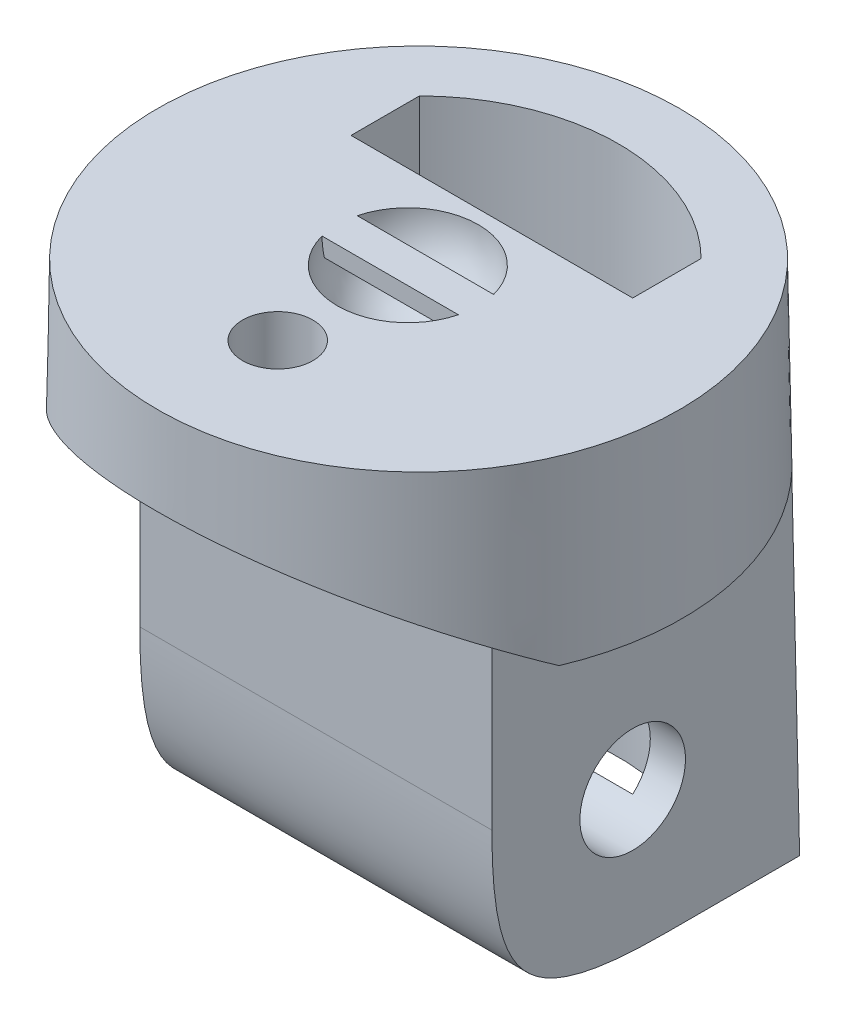
ISO-10303-21;
HEADER;
FILE_DESCRIPTION(('STEP AP214'),'2;1');
FILE_NAME('part.step','',(''),(''),'','','');
FILE_SCHEMA(('AUTOMOTIVE_DESIGN { 1 0 10303 214 1 1 1 1 }'));
ENDSEC;
DATA;
#1=APPLICATION_CONTEXT('core data for automotive mechanical design processes');
#2=APPLICATION_PROTOCOL_DEFINITION('international standard','automotive_design',2000,#1);
#3=PRODUCT_CONTEXT('',#1,'mechanical');
#4=PRODUCT('Part','Part','',(#3));
#5=PRODUCT_RELATED_PRODUCT_CATEGORY('part','',(#4));
#6=PRODUCT_DEFINITION_FORMATION('','',#4);
#7=PRODUCT_DEFINITION_CONTEXT('part definition',#1,'design');
#8=PRODUCT_DEFINITION('design','',#6,#7);
#9=PRODUCT_DEFINITION_SHAPE('','',#8);
#10=(LENGTH_UNIT() NAMED_UNIT(*) SI_UNIT(.MILLI.,.METRE.));
#11=(NAMED_UNIT(*) PLANE_ANGLE_UNIT() SI_UNIT($,.RADIAN.));
#12=(NAMED_UNIT(*) SI_UNIT($,.STERADIAN.) SOLID_ANGLE_UNIT());
#13=UNCERTAINTY_MEASURE_WITH_UNIT(LENGTH_MEASURE(1.E-05),#10,'distance_accuracy_value','');
#14=(GEOMETRIC_REPRESENTATION_CONTEXT(3) GLOBAL_UNCERTAINTY_ASSIGNED_CONTEXT((#13)) GLOBAL_UNIT_ASSIGNED_CONTEXT((#10,
#11,#12)) REPRESENTATION_CONTEXT('',''));
#15=CARTESIAN_POINT('',(0.,0.,0.));
#16=DIRECTION('',(0.,0.,1.));
#17=DIRECTION('',(1.,0.,0.));
#18=AXIS2_PLACEMENT_3D('',#15,#16,#17);
#19=CARTESIAN_POINT('',(0.,0.,0.));
#20=DIRECTION('',(0.,-1.,0.));
#21=DIRECTION('',(0.,0.,1.));
#22=AXIS2_PLACEMENT_3D('',#19,#20,#21);
#23=CONICAL_SURFACE('',#22,7.5,0.0174532925199434);
#24=CARTESIAN_POINT('',(0.,5.08726203218642,0.));
#25=DIRECTION('',(0.,-1.,0.));
#26=DIRECTION('',(0.,0.,-1.));
#27=AXIS2_PLACEMENT_3D('',#24,#25,#26);
#28=CIRCLE('',#27,7.41120151092133);
#29=CARTESIAN_POINT('',(0.,5.08726203218642,-7.41120151092133));
#30=VERTEX_POINT('',#29);
#31=EDGE_CURVE('E402',#30,#30,#28,.F.);
#32=ORIENTED_EDGE('',*,*,#31,.F.);
#33=EDGE_LOOP('',(#32));
#34=FACE_BOUND('',#33,.T.);
#35=CARTESIAN_POINT('',(0.,0.,0.));
#36=DIRECTION('',(0.,1.,0.));
#37=DIRECTION('',(0.,0.,1.));
#38=AXIS2_PLACEMENT_3D('',#35,#36,#37);
#39=CIRCLE('',#38,7.5);
#40=CARTESIAN_POINT('',(5.,0.,-5.59016994374948));
#41=VERTEX_POINT('',#40);
#42=CARTESIAN_POINT('',(6.90888086059139,0.,2.91845254444097));
#43=VERTEX_POINT('',#42);
#44=EDGE_CURVE('E372',#41,#43,#39,.F.);
#45=ORIENTED_EDGE('',*,*,#44,.F.);
#46=CARTESIAN_POINT('',(5.,6.27688547623236,-5.44229294462731));
#47=CARTESIAN_POINT('',(5.,3.77036377382038,-5.50170408148645));
#48=CARTESIAN_POINT('',(5.,1.2638316348017,-5.56067381564673));
#49=CARTESIAN_POINT('',(5.,-3.74925134349088,-5.67780370532054));
#50=CARTESIAN_POINT('',(5.,-6.25580218276311,-5.73596386090489));
#51=CARTESIAN_POINT('',(5.,-11.268920791042,-5.85154782971426));
#52=CARTESIAN_POINT('',(5.,-13.7754885600484,-5.90897164294989));
#53=CARTESIAN_POINT('',(5.,-18.7886397234326,-6.02314292162538));
#54=CARTESIAN_POINT('',(5.,-21.2952231178118,-6.07989038700611));
#55=CARTESIAN_POINT('',(5.,-23.8018134354958,-6.13632967030171));
#56=B_SPLINE_CURVE_WITH_KNOTS('',3,(#46,#47,#48,#49,#50,#51,#52,#53,#54,#55),.UNSPECIFIED.,.F.,
.F.,(4,2,2,2,4),(0.,7.52167703420821,15.0433534104974,22.5650296785992,30.0867066043943),.UNSPECIFIED.);
#57=CARTESIAN_POINT('',(5.,-10.,-5.82226138784558));
#58=VERTEX_POINT('',#57);
#59=EDGE_CURVE('E256',#41,#58,#56,.T.);
#60=ORIENTED_EDGE('',*,*,#59,.T.);
#61=CARTESIAN_POINT('',(0.,-10.,0.));
#62=DIRECTION('',(0.,1.,0.));
#63=DIRECTION('',(0.,0.,1.));
#64=AXIS2_PLACEMENT_3D('',#61,#62,#63);
#65=CIRCLE('',#64,7.67455064928218);
#66=CARTESIAN_POINT('',(-5.,-10.,-5.82226138784557));
#67=VERTEX_POINT('',#66);
#68=EDGE_CURVE('E357',#58,#67,#65,.T.);
#69=ORIENTED_EDGE('',*,*,#68,.T.);
#70=CARTESIAN_POINT('',(-5.,6.27688547623236,-5.44229294462731));
#71=CARTESIAN_POINT('',(-5.,3.77036377382037,-5.50170408148644));
#72=CARTESIAN_POINT('',(-5.,1.26383163480169,-5.56067381564673));
#73=CARTESIAN_POINT('',(-5.,-3.74925134349088,-5.67780370532054));
#74=CARTESIAN_POINT('',(-5.,-6.25580218276312,-5.73596386090489));
#75=CARTESIAN_POINT('',(-5.,-11.268920791042,-5.85154782971426));
#76=CARTESIAN_POINT('',(-5.,-13.7754885600484,-5.90897164294989));
#77=CARTESIAN_POINT('',(-5.,-18.7886397234326,-6.02314292162538));
#78=CARTESIAN_POINT('',(-5.,-21.2952231178118,-6.07989038700611));
#79=CARTESIAN_POINT('',(-5.,-23.8018134354958,-6.1363296703017));
#80=B_SPLINE_CURVE_WITH_KNOTS('',3,(#70,#71,#72,#73,#74,#75,#76,#77,#78,#79),.UNSPECIFIED.,.F.,
.F.,(4,2,2,2,4),(0.,7.52167703420821,15.0433534104974,22.5650296785992,30.0867066043943),.UNSPECIFIED.);
#81=CARTESIAN_POINT('',(-5.,0.,-5.59016994374947));
#82=VERTEX_POINT('',#81);
#83=EDGE_CURVE('E340',#82,#67,#80,.T.);
#84=ORIENTED_EDGE('',*,*,#83,.F.);
#85=CARTESIAN_POINT('',(0.,0.,0.));
#86=DIRECTION('',(0.,-1.,0.));
#87=DIRECTION('',(0.,0.,-1.));
#88=AXIS2_PLACEMENT_3D('',#85,#86,#87);
#89=CIRCLE('',#88,7.5);
#90=CARTESIAN_POINT('',(-6.90888086059139,0.,2.91845254444097));
#91=VERTEX_POINT('',#90);
#92=EDGE_CURVE('E347',#82,#91,#89,.F.);
#93=ORIENTED_EDGE('',*,*,#92,.T.);
#94=CARTESIAN_POINT('',(0.,-1.72878259922326,-0.075886752654714));
#95=DIRECTION('',(0.,0.86602540378444,-0.499999999999998));
#96=DIRECTION('',(0.,-0.499999999999998,-0.86602540378444));
#97=AXIS2_PLACEMENT_3D('',#94,#95,#96);
#98=ELLIPSE('',#97,8.69509829574299,7.52979362135817);
#99=EDGE_CURVE('E360',#43,#91,#98,.F.);
#100=ORIENTED_EDGE('',*,*,#99,.F.);
#101=EDGE_LOOP('',(#45,#60,#69,#84,#93,#100));
#102=FACE_BOUND('',#101,.T.);
#103=ADVANCED_FACE('F43',(#34,#102),#23,.T.);
#104=CARTESIAN_POINT('',(0.,-10.,0.));
#105=DIRECTION('',(0.,1.,0.));
#106=DIRECTION('',(0.,0.,1.));
#107=AXIS2_PLACEMENT_3D('',#104,#105,#106);
#108=PLANE('',#107);
#109=CARTESIAN_POINT('',(-5.5,-10.,-2.08154745555903));
#110=CARTESIAN_POINT('',(-1.83333333333334,-10.,-2.08154745555903));
#111=CARTESIAN_POINT('',(1.83333333333333,-10.,-2.08154745555903));
#112=CARTESIAN_POINT('',(5.5,-10.,-2.08154745555903));
#113=(BOUNDED_CURVE() B_SPLINE_CURVE(3,(#109,#110,#111,#112),.UNSPECIFIED.,.F.,
.F.) B_SPLINE_CURVE_WITH_KNOTS((4,4),(-0.0055,0.0055),
.UNSPECIFIED.) CURVE() GEOMETRIC_REPRESENTATION_ITEM() RATIONAL_B_SPLINE_CURVE((1.,1.,1.,1.)) REPRESENTATION_ITEM(''));
#114=CARTESIAN_POINT('',(5.,-10.,-2.08154745555903));
#115=VERTEX_POINT('',#114);
#116=CARTESIAN_POINT('',(4.,-10.,-2.08154745555903));
#117=VERTEX_POINT('',#116);
#118=EDGE_CURVE('E292',#115,#117,#113,.F.);
#119=ORIENTED_EDGE('',*,*,#118,.T.);
#120=DIRECTION('',(0.,0.,1.));
#121=VECTOR('',#120,1.);
#122=CARTESIAN_POINT('',(4.,-10.,-2.08154745555903));
#123=LINE('',#122,#121);
#124=CARTESIAN_POINT('',(4.,-10.,-4.02498758647387));
#125=VERTEX_POINT('',#124);
#126=EDGE_CURVE('E193',#125,#117,#123,.T.);
#127=ORIENTED_EDGE('',*,*,#126,.F.);
#128=CARTESIAN_POINT('',(0.,-10.,0.));
#129=DIRECTION('',(0.,-1.,0.));
#130=DIRECTION('',(0.,0.,-1.));
#131=AXIS2_PLACEMENT_3D('',#128,#129,#130);
#132=CIRCLE('',#131,5.67455064928218);
#133=CARTESIAN_POINT('',(-4.,-10.,-4.02498758647387));
#134=VERTEX_POINT('',#133);
#135=EDGE_CURVE('E190',#134,#125,#132,.T.);
#136=ORIENTED_EDGE('',*,*,#135,.F.);
#137=DIRECTION('',(0.,0.,-1.));
#138=VECTOR('',#137,1.);
#139=CARTESIAN_POINT('',(-4.,-10.,-2.08154745555903));
#140=LINE('',#139,#138);
#141=CARTESIAN_POINT('',(-4.,-10.,-2.08154745555903));
#142=VERTEX_POINT('',#141);
#143=EDGE_CURVE('E194',#142,#134,#140,.T.);
#144=ORIENTED_EDGE('',*,*,#143,.F.);
#145=CARTESIAN_POINT('',(-5.5,-10.,-2.08154745555903));
#146=CARTESIAN_POINT('',(-1.83333333333334,-10.,-2.08154745555903));
#147=CARTESIAN_POINT('',(1.83333333333333,-10.,-2.08154745555903));
#148=CARTESIAN_POINT('',(5.5,-10.,-2.08154745555903));
#149=(BOUNDED_CURVE() B_SPLINE_CURVE(3,(#145,#146,#147,#148),.UNSPECIFIED.,.F.,
.F.) B_SPLINE_CURVE_WITH_KNOTS((4,4),(-0.0055,0.0055),
.UNSPECIFIED.) CURVE() GEOMETRIC_REPRESENTATION_ITEM() RATIONAL_B_SPLINE_CURVE((1.,1.,1.,1.)) REPRESENTATION_ITEM(''));
#150=CARTESIAN_POINT('',(-5.,-10.,-2.08154745555903));
#151=VERTEX_POINT('',#150);
#152=EDGE_CURVE('E313',#142,#151,#149,.F.);
#153=ORIENTED_EDGE('',*,*,#152,.T.);
#154=DIRECTION('',(0.,0.,1.));
#155=VECTOR('',#154,1.);
#156=CARTESIAN_POINT('',(-5.,-10.,-7.67455064928218));
#157=LINE('',#156,#155);
#158=EDGE_CURVE('E368',#67,#151,#157,.T.);
#159=ORIENTED_EDGE('',*,*,#158,.F.);
#160=ORIENTED_EDGE('',*,*,#68,.F.);
#161=DIRECTION('',(0.,0.,1.));
#162=VECTOR('',#161,1.);
#163=CARTESIAN_POINT('',(5.,-10.,-7.67455064928218));
#164=LINE('',#163,#162);
#165=EDGE_CURVE('E363',#58,#115,#164,.T.);
#166=ORIENTED_EDGE('',*,*,#165,.T.);
#167=EDGE_LOOP('',(#119,#127,#136,#144,#153,#159,#160,#166));
#168=FACE_BOUND('',#167,.T.);
#169=ADVANCED_FACE('F323',(#168),#108,.F.);
#170=CARTESIAN_POINT('',(-7.67455064928218,-10.,2.91845254444097));
#171=DIRECTION('',(0.,0.,-1.));
#172=DIRECTION('',(-1.,0.,0.));
#173=AXIS2_PLACEMENT_3D('',#170,#171,#172);
#174=PLANE('',#173);
#175=DIRECTION('',(0.,1.,0.));
#176=VECTOR('',#175,1.);
#177=CARTESIAN_POINT('',(-5.,0.,2.91845254444097));
#178=LINE('',#177,#176);
#179=CARTESIAN_POINT('',(-5.,-5.,2.91845254444097));
#180=VERTEX_POINT('',#179);
#181=CARTESIAN_POINT('',(-5.,0.,2.91845254444097));
#182=VERTEX_POINT('',#181);
#183=EDGE_CURVE('E320',#180,#182,#178,.T.);
#184=ORIENTED_EDGE('',*,*,#183,.F.);
#185=CARTESIAN_POINT('',(5.5,-5.,2.91845254444097));
#186=CARTESIAN_POINT('',(1.83333333333333,-5.,2.91845254444097));
#187=CARTESIAN_POINT('',(-1.83333333333334,-5.,2.91845254444097));
#188=CARTESIAN_POINT('',(-5.5,-5.,2.91845254444097));
#189=(BOUNDED_CURVE() B_SPLINE_CURVE(3,(#185,#186,#187,#188),.UNSPECIFIED.,.F.,
.F.) B_SPLINE_CURVE_WITH_KNOTS((4,4),(-0.0055,0.0055),
.UNSPECIFIED.) CURVE() GEOMETRIC_REPRESENTATION_ITEM() RATIONAL_B_SPLINE_CURVE((1.,1.,1.,1.)) REPRESENTATION_ITEM(''));
#190=CARTESIAN_POINT('',(5.,-5.,2.91845254444097));
#191=VERTEX_POINT('',#190);
#192=EDGE_CURVE('E388',#180,#191,#189,.F.);
#193=ORIENTED_EDGE('',*,*,#192,.T.);
#194=DIRECTION('',(0.,1.,0.));
#195=VECTOR('',#194,1.);
#196=CARTESIAN_POINT('',(5.,0.,2.91845254444097));
#197=LINE('',#196,#195);
#198=CARTESIAN_POINT('',(5.,0.,2.91845254444097));
#199=VERTEX_POINT('',#198);
#200=EDGE_CURVE('E367',#191,#199,#197,.T.);
#201=ORIENTED_EDGE('',*,*,#200,.T.);
#202=DIRECTION('',(1.,0.,0.));
#203=VECTOR('',#202,1.);
#204=CARTESIAN_POINT('',(-7.67455064928218,0.,2.91845254444097));
#205=LINE('',#204,#203);
#206=EDGE_CURVE('E358',#182,#199,#205,.T.);
#207=ORIENTED_EDGE('',*,*,#206,.F.);
#208=EDGE_LOOP('',(#184,#193,#201,#207));
#209=FACE_BOUND('',#208,.T.);
#210=ADVANCED_FACE('F332',(#209),#174,.F.);
#211=CARTESIAN_POINT('',(-7.67455064928218,0.,2.91845254444097));
#212=DIRECTION('',(0.,0.86602540378444,-0.499999999999998));
#213=DIRECTION('',(0.,0.499999999999998,0.86602540378444));
#214=AXIS2_PLACEMENT_3D('',#211,#212,#213);
#215=PLANE('',#214);
#216=CARTESIAN_POINT('',(0.,0.62443171460836,4.));
#217=DIRECTION('',(0.,0.86602540378444,-0.499999999999998));
#218=DIRECTION('',(0.,0.499999999999998,0.86602540378444));
#219=AXIS2_PLACEMENT_3D('',#216,#217,#218);
#220=ELLIPSE('',#219,1.15470053837925,1.);
#221=CARTESIAN_POINT('',(0.,1.20178198379798,5.));
#222=VERTEX_POINT('',#221);
#223=EDGE_CURVE('E186',#222,#222,#220,.T.);
#224=ORIENTED_EDGE('',*,*,#223,.T.);
#225=EDGE_LOOP('',(#224));
#226=FACE_BOUND('',#225,.T.);
#227=ORIENTED_EDGE('',*,*,#99,.T.);
#228=EDGE_CURVE('E354',#91,#182,#205,.T.);
#229=ORIENTED_EDGE('',*,*,#228,.T.);
#230=ORIENTED_EDGE('',*,*,#206,.T.);
#231=EDGE_CURVE('E353',#199,#43,#205,.T.);
#232=ORIENTED_EDGE('',*,*,#231,.T.);
#233=EDGE_LOOP('',(#227,#229,#230,#232));
#234=FACE_BOUND('',#233,.T.);
#235=ADVANCED_FACE('F385',(#226,#234),#215,.F.);
#236=CARTESIAN_POINT('',(0.,0.,-7.67455064928218));
#237=DIRECTION('',(0.,-1.,0.));
#238=DIRECTION('',(0.,0.,-1.));
#239=AXIS2_PLACEMENT_3D('',#236,#237,#238);
#240=PLANE('',#239);
#241=DIRECTION('',(0.,0.,1.));
#242=VECTOR('',#241,1.);
#243=CARTESIAN_POINT('',(-5.,0.,-7.67455064928218));
#244=LINE('',#243,#242);
#245=EDGE_CURVE('E348',#82,#182,#244,.T.);
#246=ORIENTED_EDGE('',*,*,#245,.T.);
#247=ORIENTED_EDGE('',*,*,#228,.F.);
#248=ORIENTED_EDGE('',*,*,#92,.F.);
#249=EDGE_LOOP('',(#246,#247,#248));
#250=FACE_BOUND('',#249,.T.);
#251=ADVANCED_FACE('F467',(#250),#240,.T.);
#252=CARTESIAN_POINT('',(-5.,0.,-7.67455064928218));
#253=DIRECTION('',(1.,0.,0.));
#254=DIRECTION('',(0.,0.,-1.));
#255=AXIS2_PLACEMENT_3D('',#252,#253,#254);
#256=PLANE('',#255);
#257=CARTESIAN_POINT('',(-5.,-6.,-1.08154745555903));
#258=DIRECTION('',(1.,0.,0.));
#259=DIRECTION('',(0.,0.,-1.));
#260=AXIS2_PLACEMENT_3D('',#257,#258,#259);
#261=CIRCLE('',#260,1.5);
#262=CARTESIAN_POINT('',(-5.,-6.,-2.58154745555903));
#263=VERTEX_POINT('',#262);
#264=EDGE_CURVE('E390',#263,#263,#261,.T.);
#265=ORIENTED_EDGE('',*,*,#264,.T.);
#266=EDGE_LOOP('',(#265));
#267=FACE_BOUND('',#266,.T.);
#268=ORIENTED_EDGE('',*,*,#158,.T.);
#269=CARTESIAN_POINT('',(-5.,-5.,2.91845254444097));
#270=CARTESIAN_POINT('',(-5.,-10.,2.91845254444097));
#271=CARTESIAN_POINT('',(-5.,-10.,-2.08154745555903));
#272=(BOUNDED_CURVE() B_SPLINE_CURVE(2,(#269,#270,#271),.UNSPECIFIED.,.F.,
.F.) B_SPLINE_CURVE_WITH_KNOTS((3,3),(0.,1.),
.UNSPECIFIED.) CURVE() GEOMETRIC_REPRESENTATION_ITEM() RATIONAL_B_SPLINE_CURVE((1.,1.5,1.)) REPRESENTATION_ITEM(''));
#273=EDGE_CURVE('E278',#151,#180,#272,.F.);
#274=ORIENTED_EDGE('',*,*,#273,.T.);
#275=ORIENTED_EDGE('',*,*,#183,.T.);
#276=ORIENTED_EDGE('',*,*,#245,.F.);
#277=ORIENTED_EDGE('',*,*,#83,.T.);
#278=EDGE_LOOP('',(#268,#274,#275,#276,#277));
#279=FACE_BOUND('',#278,.T.);
#280=ADVANCED_FACE('F250',(#267,#279),#256,.F.);
#281=CARTESIAN_POINT('',(5.,0.,-7.67455064928218));
#282=DIRECTION('',(1.,0.,0.));
#283=DIRECTION('',(0.,0.,-1.));
#284=AXIS2_PLACEMENT_3D('',#281,#282,#283);
#285=PLANE('',#284);
#286=CARTESIAN_POINT('',(5.,-6.,-1.08154745555903));
#287=DIRECTION('',(1.,0.,0.));
#288=DIRECTION('',(0.,0.,-1.));
#289=AXIS2_PLACEMENT_3D('',#286,#287,#288);
#290=CIRCLE('',#289,1.5);
#291=CARTESIAN_POINT('',(5.,-6.,-2.58154745555903));
#292=VERTEX_POINT('',#291);
#293=EDGE_CURVE('E393',#292,#292,#290,.T.);
#294=ORIENTED_EDGE('',*,*,#293,.F.);
#295=EDGE_LOOP('',(#294));
#296=FACE_BOUND('',#295,.T.);
#297=ORIENTED_EDGE('',*,*,#200,.F.);
#298=CARTESIAN_POINT('',(5.,-10.,-2.08154745555903));
#299=CARTESIAN_POINT('',(5.,-10.,2.91845254444097));
#300=CARTESIAN_POINT('',(5.,-5.,2.91845254444097));
#301=(BOUNDED_CURVE() B_SPLINE_CURVE(2,(#298,#299,#300),.UNSPECIFIED.,.F.,
.F.) B_SPLINE_CURVE_WITH_KNOTS((3,3),(0.,1.),
.UNSPECIFIED.) CURVE() GEOMETRIC_REPRESENTATION_ITEM() RATIONAL_B_SPLINE_CURVE((1.,1.5,1.)) REPRESENTATION_ITEM(''));
#302=EDGE_CURVE('E444',#191,#115,#301,.F.);
#303=ORIENTED_EDGE('',*,*,#302,.T.);
#304=ORIENTED_EDGE('',*,*,#165,.F.);
#305=ORIENTED_EDGE('',*,*,#59,.F.);
#306=DIRECTION('',(0.,0.,1.));
#307=VECTOR('',#306,1.);
#308=CARTESIAN_POINT('',(5.,0.,-7.67455064928218));
#309=LINE('',#308,#307);
#310=EDGE_CURVE('E366',#41,#199,#309,.T.);
#311=ORIENTED_EDGE('',*,*,#310,.T.);
#312=EDGE_LOOP('',(#297,#303,#304,#305,#311));
#313=FACE_BOUND('',#312,.T.);
#314=ADVANCED_FACE('F245',(#296,#313),#285,.T.);
#315=CARTESIAN_POINT('',(0.,0.,-7.67455064928218));
#316=DIRECTION('',(0.,1.,0.));
#317=DIRECTION('',(0.,0.,1.));
#318=AXIS2_PLACEMENT_3D('',#315,#316,#317);
#319=PLANE('',#318);
#320=ORIENTED_EDGE('',*,*,#44,.T.);
#321=ORIENTED_EDGE('',*,*,#231,.F.);
#322=ORIENTED_EDGE('',*,*,#310,.F.);
#323=EDGE_LOOP('',(#320,#321,#322));
#324=FACE_BOUND('',#323,.T.);
#325=ADVANCED_FACE('F241',(#324),#319,.F.);
#326=CARTESIAN_POINT('',(-7.5,-6.,-1.08154745555903));
#327=DIRECTION('',(1.,0.,0.));
#328=DIRECTION('',(0.,0.,-1.));
#329=AXIS2_PLACEMENT_3D('',#326,#327,#328);
#330=CYLINDRICAL_SURFACE('',#329,1.5);
#331=DIRECTION('',(1.,0.,0.));
#332=VECTOR('',#331,1.);
#333=CARTESIAN_POINT('',(-7.5,-4.8819660112501,-2.08154745555903));
#334=LINE('',#333,#332);
#335=CARTESIAN_POINT('',(-4.,-4.8819660112501,-2.08154745555903));
#336=VERTEX_POINT('',#335);
#337=CARTESIAN_POINT('',(4.,-4.8819660112501,-2.08154745555903));
#338=VERTEX_POINT('',#337);
#339=EDGE_CURVE('E406',#336,#338,#334,.T.);
#340=ORIENTED_EDGE('',*,*,#339,.T.);
#341=CARTESIAN_POINT('',(4.,-6.,-1.08154745555903));
#342=DIRECTION('',(1.,0.,0.));
#343=DIRECTION('',(0.,0.,-1.));
#344=AXIS2_PLACEMENT_3D('',#341,#342,#343);
#345=CIRCLE('',#344,1.5);
#346=CARTESIAN_POINT('',(4.,-7.1180339887499,-2.08154745555903));
#347=VERTEX_POINT('',#346);
#348=EDGE_CURVE('E409',#338,#347,#345,.F.);
#349=ORIENTED_EDGE('',*,*,#348,.T.);
#350=DIRECTION('',(1.,0.,0.));
#351=VECTOR('',#350,1.);
#352=CARTESIAN_POINT('',(-7.5,-7.1180339887499,-2.08154745555903));
#353=LINE('',#352,#351);
#354=CARTESIAN_POINT('',(-4.,-7.1180339887499,-2.08154745555903));
#355=VERTEX_POINT('',#354);
#356=EDGE_CURVE('E403',#347,#355,#353,.F.);
#357=ORIENTED_EDGE('',*,*,#356,.T.);
#358=CARTESIAN_POINT('',(-4.,-6.,-1.08154745555903));
#359=DIRECTION('',(-1.,0.,0.));
#360=DIRECTION('',(0.,0.,1.));
#361=AXIS2_PLACEMENT_3D('',#358,#359,#360);
#362=CIRCLE('',#361,1.5);
#363=EDGE_CURVE('E199',#355,#336,#362,.F.);
#364=ORIENTED_EDGE('',*,*,#363,.T.);
#365=EDGE_LOOP('',(#340,#349,#357,#364));
#366=FACE_BOUND('',#365,.T.);
#367=ORIENTED_EDGE('',*,*,#293,.T.);
#368=EDGE_LOOP('',(#367));
#369=FACE_BOUND('',#368,.T.);
#370=ORIENTED_EDGE('',*,*,#264,.F.);
#371=EDGE_LOOP('',(#370));
#372=FACE_BOUND('',#371,.T.);
#373=ADVANCED_FACE('F238',(#366,#369,#372),#330,.F.);
#374=CARTESIAN_POINT('',(5.5,-10.,-2.08154745555903));
#375=CARTESIAN_POINT('',(1.83333333333333,-10.,-2.08154745555903));
#376=CARTESIAN_POINT('',(-1.83333333333334,-10.,-2.08154745555903));
#377=CARTESIAN_POINT('',(-5.5,-10.,-2.08154745555903));
#378=CARTESIAN_POINT('',(5.5,-10.,2.91845254444097));
#379=CARTESIAN_POINT('',(1.83333333333333,-10.,2.91845254444097));
#380=CARTESIAN_POINT('',(-1.83333333333334,-10.,2.91845254444097));
#381=CARTESIAN_POINT('',(-5.5,-10.,2.91845254444097));
#382=CARTESIAN_POINT('',(5.5,-5.,2.91845254444097));
#383=CARTESIAN_POINT('',(1.83333333333333,-5.,2.91845254444097));
#384=CARTESIAN_POINT('',(-1.83333333333334,-5.,2.91845254444097));
#385=CARTESIAN_POINT('',(-5.5,-5.,2.91845254444097));
#386=(BOUNDED_SURFACE() B_SPLINE_SURFACE(2,3,((#374,#375,#376,#377),(#378,#379,#380,#381),(#382,
#383,#384,#385)),.UNSPECIFIED.,.F.,.F.,.F.) B_SPLINE_SURFACE_WITH_KNOTS((3,3),(4,4),(0.,1.),
(-0.0055,0.0055),.UNSPECIFIED.) GEOMETRIC_REPRESENTATION_ITEM() RATIONAL_B_SPLINE_SURFACE(((1.,
1.,1.,1.),(1.5,1.5,1.5,1.5),(1.,1.,1.,1.))) REPRESENTATION_ITEM('') SURFACE());
#387=CARTESIAN_POINT('',(-5.5,-10.,-2.08154745555903));
#388=CARTESIAN_POINT('',(-1.83333333333334,-10.,-2.08154745555903));
#389=CARTESIAN_POINT('',(1.83333333333333,-10.,-2.08154745555903));
#390=CARTESIAN_POINT('',(5.5,-10.,-2.08154745555903));
#391=(BOUNDED_CURVE() B_SPLINE_CURVE(3,(#387,#388,#389,#390),.UNSPECIFIED.,.F.,
.F.) B_SPLINE_CURVE_WITH_KNOTS((4,4),(-0.0055,0.0055),
.UNSPECIFIED.) CURVE() GEOMETRIC_REPRESENTATION_ITEM() RATIONAL_B_SPLINE_CURVE((1.,1.,1.,1.)) REPRESENTATION_ITEM(''));
#392=EDGE_CURVE('E189',#117,#142,#391,.F.);
#393=ORIENTED_EDGE('',*,*,#302,.F.);
#394=ORIENTED_EDGE('',*,*,#192,.F.);
#395=ORIENTED_EDGE('',*,*,#273,.F.);
#396=ORIENTED_EDGE('',*,*,#152,.F.);
#397=ORIENTED_EDGE('',*,*,#392,.F.);
#398=ORIENTED_EDGE('',*,*,#118,.F.);
#399=EDGE_LOOP('',(#393,#394,#395,#396,#397,#398));
#400=FACE_BOUND('',#399,.T.);
#401=ADVANCED_FACE('F46',(#400),#386,.T.);
#402=CARTESIAN_POINT('',(-7.5,5.08726203218642,11.7963262650345));
#403=DIRECTION('',(0.,-1.,0.));
#404=DIRECTION('',(0.,0.,-1.));
#405=AXIS2_PLACEMENT_3D('',#402,#403,#404);
#406=PLANE('',#405);
#407=CARTESIAN_POINT('',(0.,5.08726203218642,0.305006360196813));
#408=DIRECTION('',(0.,-1.,0.));
#409=DIRECTION('',(0.,0.,-1.));
#410=AXIS2_PLACEMENT_3D('',#407,#408,#409);
#411=CIRCLE('',#410,2.);
#412=CARTESIAN_POINT('',(1.93649167310371,5.08726203218642,-0.194993639803186));
#413=VERTEX_POINT('',#412);
#414=CARTESIAN_POINT('',(-1.93649167310371,5.08726203218642,-0.194993639803186));
#415=VERTEX_POINT('',#414);
#416=EDGE_CURVE('E164',#413,#415,#411,.F.);
#417=ORIENTED_EDGE('',*,*,#416,.F.);
#418=DIRECTION('',(-1.,0.,0.));
#419=VECTOR('',#418,1.);
#420=CARTESIAN_POINT('',(-1.93649167310371,5.08726203218642,-0.194993639803186));
#421=LINE('',#420,#419);
#422=EDGE_CURVE('E175',#413,#415,#421,.T.);
#423=ORIENTED_EDGE('',*,*,#422,.T.);
#424=EDGE_LOOP('',(#417,#423));
#425=FACE_BOUND('',#424,.T.);
#426=CARTESIAN_POINT('',(-1.93649167310371,5.08726203218642,0.805006360196814));
#427=VERTEX_POINT('',#426);
#428=CARTESIAN_POINT('',(1.93649167310371,5.08726203218642,0.805006360196814));
#429=VERTEX_POINT('',#428);
#430=EDGE_CURVE('E157',#427,#429,#411,.F.);
#431=ORIENTED_EDGE('',*,*,#430,.F.);
#432=DIRECTION('',(1.,0.,0.));
#433=VECTOR('',#432,1.);
#434=CARTESIAN_POINT('',(-1.93649167310371,5.08726203218642,0.805006360196814));
#435=LINE('',#434,#433);
#436=EDGE_CURVE('E162',#427,#429,#435,.T.);
#437=ORIENTED_EDGE('',*,*,#436,.T.);
#438=EDGE_LOOP('',(#431,#437));
#439=FACE_BOUND('',#438,.T.);
#440=CARTESIAN_POINT('',(0.,5.08726203218642,4.));
#441=DIRECTION('',(0.,1.,0.));
#442=DIRECTION('',(0.,0.,1.));
#443=AXIS2_PLACEMENT_3D('',#440,#441,#442);
#444=CIRCLE('',#443,1.);
#445=CARTESIAN_POINT('',(0.,5.08726203218642,5.));
#446=VERTEX_POINT('',#445);
#447=EDGE_CURVE('E163',#446,#446,#444,.T.);
#448=ORIENTED_EDGE('',*,*,#447,.F.);
#449=EDGE_LOOP('',(#448));
#450=FACE_BOUND('',#449,.T.);
#451=DIRECTION('',(0.,0.,1.));
#452=VECTOR('',#451,1.);
#453=CARTESIAN_POINT('',(4.,5.08726203218642,11.7963262650345));
#454=LINE('',#453,#452);
#455=CARTESIAN_POINT('',(4.,5.08726203218642,-4.02498758647387));
#456=VERTEX_POINT('',#455);
#457=CARTESIAN_POINT('',(4.,5.08726203218642,-2.08154745555903));
#458=VERTEX_POINT('',#457);
#459=EDGE_CURVE('E426',#456,#458,#454,.T.);
#460=ORIENTED_EDGE('',*,*,#459,.T.);
#461=DIRECTION('',(-1.,0.,0.));
#462=VECTOR('',#461,1.);
#463=CARTESIAN_POINT('',(-7.5,5.08726203218642,-2.08154745555903));
#464=LINE('',#463,#462);
#465=CARTESIAN_POINT('',(-4.,5.08726203218642,-2.08154745555903));
#466=VERTEX_POINT('',#465);
#467=EDGE_CURVE('E308',#458,#466,#464,.T.);
#468=ORIENTED_EDGE('',*,*,#467,.T.);
#469=DIRECTION('',(0.,0.,-1.));
#470=VECTOR('',#469,1.);
#471=CARTESIAN_POINT('',(-4.00000000000002,5.08726203218642,11.7963262650345));
#472=LINE('',#471,#470);
#473=CARTESIAN_POINT('',(-4.,5.08726203218642,-4.02498758647387));
#474=VERTEX_POINT('',#473);
#475=EDGE_CURVE('E440',#466,#474,#472,.T.);
#476=ORIENTED_EDGE('',*,*,#475,.T.);
#477=CARTESIAN_POINT('',(0.,5.08726203218642,0.));
#478=DIRECTION('',(0.,-1.,0.));
#479=DIRECTION('',(0.,0.,-1.));
#480=AXIS2_PLACEMENT_3D('',#477,#478,#479);
#481=CIRCLE('',#480,5.67455064928218);
#482=EDGE_CURVE('E439',#474,#456,#481,.T.);
#483=ORIENTED_EDGE('',*,*,#482,.T.);
#484=EDGE_LOOP('',(#460,#468,#476,#483));
#485=FACE_BOUND('',#484,.T.);
#486=ORIENTED_EDGE('',*,*,#31,.T.);
#487=EDGE_LOOP('',(#486));
#488=FACE_BOUND('',#487,.T.);
#489=ADVANCED_FACE('F159',(#425,#439,#450,#485,#488),#406,.F.);
#490=CARTESIAN_POINT('',(4.,5.13726203218642,-2.08154745555903));
#491=DIRECTION('',(0.,0.,1.));
#492=DIRECTION('',(1.,0.,0.));
#493=AXIS2_PLACEMENT_3D('',#490,#491,#492);
#494=PLANE('',#493);
#495=DIRECTION('',(0.,-1.,0.));
#496=VECTOR('',#495,1.);
#497=CARTESIAN_POINT('',(4.,5.13726203218642,-2.08154745555903));
#498=LINE('',#497,#496);
#499=EDGE_CURVE('E200',#347,#117,#498,.T.);
#500=ORIENTED_EDGE('',*,*,#499,.T.);
#501=ORIENTED_EDGE('',*,*,#392,.T.);
#502=DIRECTION('',(0.,-1.,0.));
#503=VECTOR('',#502,1.);
#504=CARTESIAN_POINT('',(-4.,5.13726203218642,-2.08154745555903));
#505=LINE('',#504,#503);
#506=EDGE_CURVE('E219',#355,#142,#505,.T.);
#507=ORIENTED_EDGE('',*,*,#506,.F.);
#508=ORIENTED_EDGE('',*,*,#356,.F.);
#509=EDGE_LOOP('',(#500,#501,#507,#508));
#510=FACE_BOUND('',#509,.T.);
#511=ADVANCED_FACE('F222',(#510),#494,.F.);
#512=EDGE_CURVE('E413',#466,#336,#505,.T.);
#513=ORIENTED_EDGE('',*,*,#512,.F.);
#514=ORIENTED_EDGE('',*,*,#467,.F.);
#515=EDGE_CURVE('E195',#458,#338,#498,.T.);
#516=ORIENTED_EDGE('',*,*,#515,.T.);
#517=ORIENTED_EDGE('',*,*,#339,.F.);
#518=EDGE_LOOP('',(#513,#514,#516,#517));
#519=FACE_BOUND('',#518,.T.);
#520=ADVANCED_FACE('F232',(#519),#494,.F.);
#521=CARTESIAN_POINT('',(4.,5.13726203218642,-2.08154745555903));
#522=DIRECTION('',(1.,0.,0.));
#523=DIRECTION('',(0.,0.,-1.));
#524=AXIS2_PLACEMENT_3D('',#521,#522,#523);
#525=PLANE('',#524);
#526=ORIENTED_EDGE('',*,*,#515,.F.);
#527=ORIENTED_EDGE('',*,*,#459,.F.);
#528=DIRECTION('',(0.,-1.,0.));
#529=VECTOR('',#528,1.);
#530=CARTESIAN_POINT('',(4.,5.13726203218642,-4.02498758647387));
#531=LINE('',#530,#529);
#532=EDGE_CURVE('E201',#456,#125,#531,.T.);
#533=ORIENTED_EDGE('',*,*,#532,.T.);
#534=ORIENTED_EDGE('',*,*,#126,.T.);
#535=ORIENTED_EDGE('',*,*,#499,.F.);
#536=ORIENTED_EDGE('',*,*,#348,.F.);
#537=EDGE_LOOP('',(#526,#527,#533,#534,#535,#536));
#538=FACE_BOUND('',#537,.T.);
#539=ADVANCED_FACE('F422',(#538),#525,.F.);
#540=CARTESIAN_POINT('',(0.,5.13726203218642,0.));
#541=DIRECTION('',(0.,-1.,0.));
#542=DIRECTION('',(0.,0.,-1.));
#543=AXIS2_PLACEMENT_3D('',#540,#541,#542);
#544=CYLINDRICAL_SURFACE('',#543,5.67455064928218);
#545=DIRECTION('',(0.,-1.,0.));
#546=VECTOR('',#545,1.);
#547=CARTESIAN_POINT('',(-4.,5.13726203218642,-4.02498758647387));
#548=LINE('',#547,#546);
#549=EDGE_CURVE('E415',#474,#134,#548,.T.);
#550=ORIENTED_EDGE('',*,*,#549,.T.);
#551=ORIENTED_EDGE('',*,*,#135,.T.);
#552=ORIENTED_EDGE('',*,*,#532,.F.);
#553=ORIENTED_EDGE('',*,*,#482,.F.);
#554=EDGE_LOOP('',(#550,#551,#552,#553));
#555=FACE_BOUND('',#554,.T.);
#556=ADVANCED_FACE('F429',(#555),#544,.F.);
#557=CARTESIAN_POINT('',(-4.,5.13726203218642,-2.08154745555903));
#558=DIRECTION('',(-1.,0.,0.));
#559=DIRECTION('',(0.,0.,1.));
#560=AXIS2_PLACEMENT_3D('',#557,#558,#559);
#561=PLANE('',#560);
#562=ORIENTED_EDGE('',*,*,#506,.T.);
#563=ORIENTED_EDGE('',*,*,#143,.T.);
#564=ORIENTED_EDGE('',*,*,#549,.F.);
#565=ORIENTED_EDGE('',*,*,#475,.F.);
#566=ORIENTED_EDGE('',*,*,#512,.T.);
#567=ORIENTED_EDGE('',*,*,#363,.F.);
#568=EDGE_LOOP('',(#562,#563,#564,#565,#566,#567));
#569=FACE_BOUND('',#568,.T.);
#570=ADVANCED_FACE('F233',(#569),#561,.F.);
#571=CARTESIAN_POINT('',(0.,-10.025,4.));
#572=DIRECTION('',(0.,1.,0.));
#573=DIRECTION('',(0.,0.,1.));
#574=AXIS2_PLACEMENT_3D('',#571,#572,#573);
#575=CYLINDRICAL_SURFACE('',#574,1.);
#576=ORIENTED_EDGE('',*,*,#447,.T.);
#577=EDGE_LOOP('',(#576));
#578=FACE_BOUND('',#577,.T.);
#579=ORIENTED_EDGE('',*,*,#223,.F.);
#580=EDGE_LOOP('',(#579));
#581=FACE_BOUND('',#580,.T.);
#582=ADVANCED_FACE('F481',(#578,#581),#575,.F.);
#583=CARTESIAN_POINT('',(0.,5.08726203218642,0.305006360196813));
#584=DIRECTION('',(-1.,0.,0.));
#585=DIRECTION('',(0.,0.,-1.));
#586=AXIS2_PLACEMENT_3D('',#583,#584,#585);
#587=SPHERICAL_SURFACE('',#586,2.);
#588=CARTESIAN_POINT('',(0.,5.08726203218642,-0.194993639803186));
#589=DIRECTION('',(0.,0.,-1.));
#590=DIRECTION('',(-1.,0.,0.));
#591=AXIS2_PLACEMENT_3D('',#588,#589,#590);
#592=CIRCLE('',#591,1.93649167310371);
#593=CARTESIAN_POINT('',(1.87082869338697,4.58726203218642,-0.194993639803186));
#594=VERTEX_POINT('',#593);
#595=EDGE_CURVE('E13',#413,#594,#592,.T.);
#596=ORIENTED_EDGE('',*,*,#595,.F.);
#597=ORIENTED_EDGE('',*,*,#416,.T.);
#598=CARTESIAN_POINT('',(-1.87082869338697,4.58726203218642,-0.194993639803186));
#599=VERTEX_POINT('',#598);
#600=EDGE_CURVE('E51',#599,#415,#592,.T.);
#601=ORIENTED_EDGE('',*,*,#600,.F.);
#602=CARTESIAN_POINT('',(0.,4.58726203218642,0.305006360196813));
#603=DIRECTION('',(0.,1.,0.));
#604=DIRECTION('',(0.,0.,1.));
#605=AXIS2_PLACEMENT_3D('',#602,#603,#604);
#606=CIRCLE('',#605,1.93649167310371);
#607=CARTESIAN_POINT('',(-1.87082869338697,4.58726203218642,0.805006360196814));
#608=VERTEX_POINT('',#607);
#609=EDGE_CURVE('E170',#599,#608,#606,.T.);
#610=ORIENTED_EDGE('',*,*,#609,.T.);
#611=CARTESIAN_POINT('',(0.,5.08726203218642,0.805006360196814));
#612=DIRECTION('',(0.,0.,1.));
#613=DIRECTION('',(1.,0.,0.));
#614=AXIS2_PLACEMENT_3D('',#611,#612,#613);
#615=CIRCLE('',#614,1.93649167310371);
#616=EDGE_CURVE('E167',#427,#608,#615,.T.);
#617=ORIENTED_EDGE('',*,*,#616,.F.);
#618=ORIENTED_EDGE('',*,*,#430,.T.);
#619=CARTESIAN_POINT('',(1.87082869338697,4.58726203218642,0.805006360196814));
#620=VERTEX_POINT('',#619);
#621=EDGE_CURVE('E56',#620,#429,#615,.T.);
#622=ORIENTED_EDGE('',*,*,#621,.F.);
#623=EDGE_CURVE('E63',#620,#594,#606,.T.);
#624=ORIENTED_EDGE('',*,*,#623,.T.);
#625=EDGE_LOOP('',(#596,#597,#601,#610,#617,#618,#622,#624));
#626=FACE_BOUND('',#625,.T.);
#627=ADVANCED_FACE('F168',(#626),#587,.F.);
#628=CARTESIAN_POINT('',(-1.93649167310371,4.58726203218642,-0.194993639803186));
#629=DIRECTION('',(0.,0.,-1.));
#630=DIRECTION('',(-1.,0.,0.));
#631=AXIS2_PLACEMENT_3D('',#628,#629,#630);
#632=PLANE('',#631);
#633=ORIENTED_EDGE('',*,*,#422,.F.);
#634=ORIENTED_EDGE('',*,*,#595,.T.);
#635=DIRECTION('',(-1.,0.,0.));
#636=VECTOR('',#635,1.);
#637=CARTESIAN_POINT('',(-1.93649167310371,4.58726203218642,-0.194993639803186));
#638=LINE('',#637,#636);
#639=EDGE_CURVE('E181',#594,#599,#638,.T.);
#640=ORIENTED_EDGE('',*,*,#639,.T.);
#641=ORIENTED_EDGE('',*,*,#600,.T.);
#642=EDGE_LOOP('',(#633,#634,#640,#641));
#643=FACE_BOUND('',#642,.T.);
#644=ADVANCED_FACE('F489',(#643),#632,.T.);
#645=CARTESIAN_POINT('',(-1.93649167310371,4.58726203218642,0.805006360196814));
#646=DIRECTION('',(0.,0.,1.));
#647=DIRECTION('',(1.,0.,0.));
#648=AXIS2_PLACEMENT_3D('',#645,#646,#647);
#649=PLANE('',#648);
#650=ORIENTED_EDGE('',*,*,#436,.F.);
#651=ORIENTED_EDGE('',*,*,#616,.T.);
#652=DIRECTION('',(1.,0.,0.));
#653=VECTOR('',#652,1.);
#654=CARTESIAN_POINT('',(-1.93649167310371,4.58726203218642,0.805006360196814));
#655=LINE('',#654,#653);
#656=EDGE_CURVE('E178',#608,#620,#655,.T.);
#657=ORIENTED_EDGE('',*,*,#656,.T.);
#658=ORIENTED_EDGE('',*,*,#621,.T.);
#659=EDGE_LOOP('',(#650,#651,#657,#658));
#660=FACE_BOUND('',#659,.T.);
#661=ADVANCED_FACE('F174',(#660),#649,.T.);
#662=CARTESIAN_POINT('',(0.,4.58726203218642,0.305006360196813));
#663=DIRECTION('',(0.,1.,0.));
#664=DIRECTION('',(0.,0.,1.));
#665=AXIS2_PLACEMENT_3D('',#662,#663,#664);
#666=PLANE('',#665);
#667=ORIENTED_EDGE('',*,*,#623,.F.);
#668=ORIENTED_EDGE('',*,*,#656,.F.);
#669=ORIENTED_EDGE('',*,*,#609,.F.);
#670=ORIENTED_EDGE('',*,*,#639,.F.);
#671=EDGE_LOOP('',(#667,#668,#669,#670));
#672=FACE_BOUND('',#671,.T.);
#673=ADVANCED_FACE('F553',(#672),#666,.F.);
#674=CLOSED_SHELL('',(#103,#169,#210,#235,#251,#280,#314,#325,#373,#401,#489,#511,#520,#539,
#556,#570,#582,#627,#644,#661,#673));
#675=MANIFOLD_SOLID_BREP('B2',#674);
#676=ADVANCED_BREP_SHAPE_REPRESENTATION('',(#18,#675),#14);
#677=SHAPE_DEFINITION_REPRESENTATION(#9,#676);
ENDSEC;
END-ISO-10303-21;
